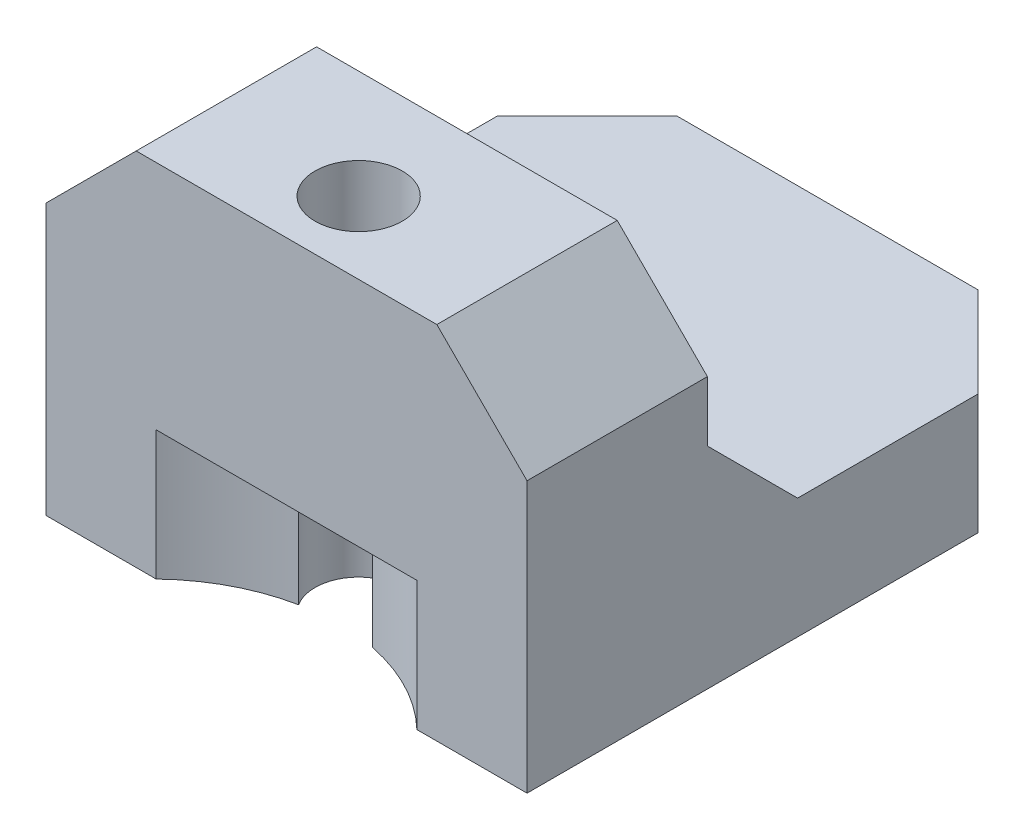
ISO-10303-21;
HEADER;
FILE_DESCRIPTION(('STEP AP214'),'2;1');
FILE_NAME('part.step','',(''),(''),'','','');
FILE_SCHEMA(('AUTOMOTIVE_DESIGN { 1 0 10303 214 1 1 1 1 }'));
ENDSEC;
DATA;
#1=APPLICATION_CONTEXT('core data for automotive mechanical design processes');
#2=APPLICATION_PROTOCOL_DEFINITION('international standard','automotive_design',2000,#1);
#3=PRODUCT_CONTEXT('',#1,'mechanical');
#4=PRODUCT('Part','Part','',(#3));
#5=PRODUCT_RELATED_PRODUCT_CATEGORY('part','',(#4));
#6=PRODUCT_DEFINITION_FORMATION('','',#4);
#7=PRODUCT_DEFINITION_CONTEXT('part definition',#1,'design');
#8=PRODUCT_DEFINITION('design','',#6,#7);
#9=PRODUCT_DEFINITION_SHAPE('','',#8);
#10=(LENGTH_UNIT() NAMED_UNIT(*) SI_UNIT(.MILLI.,.METRE.));
#11=(NAMED_UNIT(*) PLANE_ANGLE_UNIT() SI_UNIT($,.RADIAN.));
#12=(NAMED_UNIT(*) SI_UNIT($,.STERADIAN.) SOLID_ANGLE_UNIT());
#13=UNCERTAINTY_MEASURE_WITH_UNIT(LENGTH_MEASURE(1.E-05),#10,'distance_accuracy_value','');
#14=(GEOMETRIC_REPRESENTATION_CONTEXT(3) GLOBAL_UNCERTAINTY_ASSIGNED_CONTEXT((#13)) GLOBAL_UNIT_ASSIGNED_CONTEXT((#10,
#11,#12)) REPRESENTATION_CONTEXT('',''));
#15=CARTESIAN_POINT('',(0.,0.,0.));
#16=DIRECTION('',(0.,0.,1.));
#17=DIRECTION('',(1.,0.,0.));
#18=AXIS2_PLACEMENT_3D('',#15,#16,#17);
#19=CARTESIAN_POINT('',(8.,2.8,4.5));
#20=DIRECTION('',(0.,-1.,0.));
#21=DIRECTION('',(0.,0.,-1.));
#22=AXIS2_PLACEMENT_3D('',#19,#20,#21);
#23=PLANE('',#22);
#24=CARTESIAN_POINT('',(8.,2.8,4.5));
#25=DIRECTION('',(0.,-1.,0.));
#26=DIRECTION('',(0.,0.,-1.));
#27=AXIS2_PLACEMENT_3D('',#24,#25,#26);
#28=CIRCLE('',#27,6.25);
#29=CARTESIAN_POINT('',(9.22756617522469,2.8,-1.62826086956522));
#30=VERTEX_POINT('',#29);
#31=CARTESIAN_POINT('',(9.74999999999991,2.8,-1.50000000000003));
#32=VERTEX_POINT('',#31);
#33=EDGE_CURVE('E166',#30,#32,#28,.T.);
#34=ORIENTED_EDGE('',*,*,#33,.T.);
#35=DIRECTION('',(-1.,0.,0.));
#36=VECTOR('',#35,1.);
#37=CARTESIAN_POINT('',(3.66266210677563,2.8,-1.50000000000003));
#38=LINE('',#37,#36);
#39=CARTESIAN_POINT('',(9.13688170009023,2.8,-1.50000000000003));
#40=VERTEX_POINT('',#39);
#41=EDGE_CURVE('E296',#32,#40,#38,.T.);
#42=ORIENTED_EDGE('',*,*,#41,.T.);
#43=CARTESIAN_POINT('',(8.,2.8,-2.4));
#44=DIRECTION('',(0.,-1.,0.));
#45=DIRECTION('',(0.,0.,-1.));
#46=AXIS2_PLACEMENT_3D('',#43,#44,#45);
#47=CIRCLE('',#46,1.45);
#48=EDGE_CURVE('E290',#40,#30,#47,.F.);
#49=ORIENTED_EDGE('',*,*,#48,.T.);
#50=EDGE_LOOP('',(#34,#42,#49));
#51=FACE_BOUND('',#50,.T.);
#52=ADVANCED_FACE('F37',(#51),#23,.T.);
#53=CARTESIAN_POINT('',(8.,0.,-10.));
#54=DIRECTION('',(0.,1.,0.));
#55=DIRECTION('',(0.,0.,1.));
#56=AXIS2_PLACEMENT_3D('',#53,#54,#55);
#57=CYLINDRICAL_SURFACE('',#56,1.65);
#58=CARTESIAN_POINT('',(8.,0.,-10.));
#59=DIRECTION('',(0.,1.,0.));
#60=DIRECTION('',(0.,0.,1.));
#61=AXIS2_PLACEMENT_3D('',#58,#59,#60);
#62=CIRCLE('',#61,1.65);
#63=CARTESIAN_POINT('',(8.,0.,-8.35));
#64=VERTEX_POINT('',#63);
#65=EDGE_CURVE('E209',#64,#64,#62,.T.);
#66=ORIENTED_EDGE('',*,*,#65,.F.);
#67=EDGE_LOOP('',(#66));
#68=FACE_BOUND('',#67,.T.);
#69=CARTESIAN_POINT('',(8.,4.,-10.));
#70=DIRECTION('',(0.,1.,0.));
#71=DIRECTION('',(0.,0.,1.));
#72=AXIS2_PLACEMENT_3D('',#69,#70,#71);
#73=CIRCLE('',#72,1.65);
#74=CARTESIAN_POINT('',(8.,4.,-8.35));
#75=VERTEX_POINT('',#74);
#76=EDGE_CURVE('E208',#75,#75,#73,.T.);
#77=ORIENTED_EDGE('',*,*,#76,.T.);
#78=EDGE_LOOP('',(#77));
#79=FACE_BOUND('',#78,.T.);
#80=ADVANCED_FACE('F320',(#68,#79),#57,.F.);
#81=CARTESIAN_POINT('',(0.,7.00000000000005,-6.));
#82=DIRECTION('',(0.,0.707106781186544,-0.707106781186551));
#83=DIRECTION('',(1.,0.,0.));
#84=AXIS2_PLACEMENT_3D('',#81,#82,#83);
#85=PLANE('',#84);
#86=CARTESIAN_POINT('',(8.,3.00000000000001,-10.));
#87=DIRECTION('',(0.,0.707106781186544,-0.707106781186551));
#88=DIRECTION('',(0.,-0.707106781186551,-0.707106781186544));
#89=AXIS2_PLACEMENT_3D('',#86,#87,#88);
#90=ELLIPSE('',#89,4.24264068711931,3.);
#91=CARTESIAN_POINT('',(5.1715728752538,4.,-9.00000000000002));
#92=VERTEX_POINT('',#91);
#93=CARTESIAN_POINT('',(10.8284271247462,4.,-9.00000000000002));
#94=VERTEX_POINT('',#93);
#95=EDGE_CURVE('E288',#92,#94,#90,.T.);
#96=ORIENTED_EDGE('',*,*,#95,.F.);
#97=DIRECTION('',(1.,0.,0.));
#98=VECTOR('',#97,1.);
#99=CARTESIAN_POINT('',(16.,4.,-9.00000000000002));
#100=LINE('',#99,#98);
#101=CARTESIAN_POINT('',(0.,4.,-9.00000000000002));
#102=VERTEX_POINT('',#101);
#103=EDGE_CURVE('E262',#102,#92,#100,.T.);
#104=ORIENTED_EDGE('',*,*,#103,.F.);
#105=DIRECTION('',(0.,0.707106781186551,0.707106781186544));
#106=VECTOR('',#105,1.);
#107=CARTESIAN_POINT('',(0.,8.50000000000001,-4.50000000000006));
#108=LINE('',#107,#106);
#109=CARTESIAN_POINT('',(0.,7.00000000000005,-6.));
#110=VERTEX_POINT('',#109);
#111=EDGE_CURVE('E265',#110,#102,#108,.F.);
#112=ORIENTED_EDGE('',*,*,#111,.F.);
#113=DIRECTION('',(-1.,0.,0.));
#114=VECTOR('',#113,1.);
#115=CARTESIAN_POINT('',(0.,7.00000000000005,-6.));
#116=LINE('',#115,#114);
#117=CARTESIAN_POINT('',(16.,7.00000000000005,-6.));
#118=VERTEX_POINT('',#117);
#119=EDGE_CURVE('E257',#118,#110,#116,.T.);
#120=ORIENTED_EDGE('',*,*,#119,.F.);
#121=DIRECTION('',(0.,-0.707106781186551,-0.707106781186544));
#122=VECTOR('',#121,1.);
#123=CARTESIAN_POINT('',(16.,8.50000000000001,-4.50000000000006));
#124=LINE('',#123,#122);
#125=CARTESIAN_POINT('',(16.,4.,-9.00000000000002));
#126=VERTEX_POINT('',#125);
#127=EDGE_CURVE('E267',#126,#118,#124,.F.);
#128=ORIENTED_EDGE('',*,*,#127,.F.);
#129=DIRECTION('',(1.,0.,0.));
#130=VECTOR('',#129,1.);
#131=CARTESIAN_POINT('',(16.,4.,-9.00000000000002));
#132=LINE('',#131,#130);
#133=EDGE_CURVE('E260',#94,#126,#132,.T.);
#134=ORIENTED_EDGE('',*,*,#133,.F.);
#135=EDGE_LOOP('',(#96,#104,#112,#120,#128,#134));
#136=FACE_BOUND('',#135,.T.);
#137=ADVANCED_FACE('F325',(#136),#85,.T.);
#138=CARTESIAN_POINT('',(0.,4.,0.));
#139=DIRECTION('',(0.,-1.,0.));
#140=DIRECTION('',(0.,0.,-1.));
#141=AXIS2_PLACEMENT_3D('',#138,#139,#140);
#142=PLANE('',#141);
#143=ORIENTED_EDGE('',*,*,#103,.T.);
#144=CARTESIAN_POINT('',(8.,4.,-10.));
#145=DIRECTION('',(0.,1.,0.));
#146=DIRECTION('',(0.,0.,1.));
#147=AXIS2_PLACEMENT_3D('',#144,#145,#146);
#148=CIRCLE('',#147,3.);
#149=EDGE_CURVE('E197',#92,#94,#148,.T.);
#150=ORIENTED_EDGE('',*,*,#149,.T.);
#151=ORIENTED_EDGE('',*,*,#133,.T.);
#152=DIRECTION('',(0.,0.,-1.));
#153=VECTOR('',#152,1.);
#154=CARTESIAN_POINT('',(16.,4.,0.));
#155=LINE('',#154,#153);
#156=CARTESIAN_POINT('',(16.,4.,-15.));
#157=VERTEX_POINT('',#156);
#158=EDGE_CURVE('E218',#126,#157,#155,.T.);
#159=ORIENTED_EDGE('',*,*,#158,.T.);
#160=DIRECTION('',(0.707106781186546,0.,0.707106781186549));
#161=VECTOR('',#160,1.);
#162=CARTESIAN_POINT('',(13.,4.,-18.));
#163=LINE('',#162,#161);
#164=CARTESIAN_POINT('',(13.,4.,-18.));
#165=VERTEX_POINT('',#164);
#166=EDGE_CURVE('E250',#157,#165,#163,.F.);
#167=ORIENTED_EDGE('',*,*,#166,.T.);
#168=DIRECTION('',(-1.,0.,0.));
#169=VECTOR('',#168,1.);
#170=CARTESIAN_POINT('',(0.,4.,-18.));
#171=LINE('',#170,#169);
#172=CARTESIAN_POINT('',(3.00000000000001,4.,-18.));
#173=VERTEX_POINT('',#172);
#174=EDGE_CURVE('E221',#165,#173,#171,.T.);
#175=ORIENTED_EDGE('',*,*,#174,.T.);
#176=DIRECTION('',(0.707106781186549,0.,-0.707106781186546));
#177=VECTOR('',#176,1.);
#178=CARTESIAN_POINT('',(0.,4.,-15.));
#179=LINE('',#178,#177);
#180=CARTESIAN_POINT('',(0.,4.,-15.));
#181=VERTEX_POINT('',#180);
#182=EDGE_CURVE('E252',#173,#181,#179,.F.);
#183=ORIENTED_EDGE('',*,*,#182,.T.);
#184=DIRECTION('',(0.,0.,1.));
#185=VECTOR('',#184,1.);
#186=CARTESIAN_POINT('',(0.,4.,0.));
#187=LINE('',#186,#185);
#188=EDGE_CURVE('E215',#181,#102,#187,.T.);
#189=ORIENTED_EDGE('',*,*,#188,.T.);
#190=EDGE_LOOP('',(#143,#150,#151,#159,#167,#175,#183,#189));
#191=FACE_BOUND('',#190,.T.);
#192=ORIENTED_EDGE('',*,*,#76,.F.);
#193=EDGE_LOOP('',(#192));
#194=FACE_BOUND('',#193,.T.);
#195=ADVANCED_FACE('F354',(#191,#194),#142,.F.);
#196=CARTESIAN_POINT('',(0.,4.,0.));
#197=DIRECTION('',(1.,0.,0.));
#198=DIRECTION('',(0.,0.,-1.));
#199=AXIS2_PLACEMENT_3D('',#196,#197,#198);
#200=PLANE('',#199);
#201=DIRECTION('',(0.,-1.,0.));
#202=VECTOR('',#201,1.);
#203=CARTESIAN_POINT('',(0.,4.,0.));
#204=LINE('',#203,#202);
#205=CARTESIAN_POINT('',(0.,8.99999999999999,0.));
#206=VERTEX_POINT('',#205);
#207=CARTESIAN_POINT('',(0.,0.,0.));
#208=VERTEX_POINT('',#207);
#209=EDGE_CURVE('E236',#206,#208,#204,.T.);
#210=ORIENTED_EDGE('',*,*,#209,.F.);
#211=DIRECTION('',(0.,0.,-1.));
#212=VECTOR('',#211,1.);
#213=CARTESIAN_POINT('',(0.,8.99999999999999,0.));
#214=LINE('',#213,#212);
#215=CARTESIAN_POINT('',(0.,8.99999999999999,-6.));
#216=VERTEX_POINT('',#215);
#217=EDGE_CURVE('E280',#206,#216,#214,.T.);
#218=ORIENTED_EDGE('',*,*,#217,.T.);
#219=DIRECTION('',(0.,-1.,0.));
#220=VECTOR('',#219,1.);
#221=CARTESIAN_POINT('',(0.,12.,-6.));
#222=LINE('',#221,#220);
#223=EDGE_CURVE('E204',#216,#110,#222,.T.);
#224=ORIENTED_EDGE('',*,*,#223,.T.);
#225=ORIENTED_EDGE('',*,*,#111,.T.);
#226=ORIENTED_EDGE('',*,*,#188,.F.);
#227=DIRECTION('',(0.,-1.,0.));
#228=VECTOR('',#227,1.);
#229=CARTESIAN_POINT('',(0.,4.,-15.));
#230=LINE('',#229,#228);
#231=CARTESIAN_POINT('',(0.,0.,-15.));
#232=VERTEX_POINT('',#231);
#233=EDGE_CURVE('E238',#181,#232,#230,.T.);
#234=ORIENTED_EDGE('',*,*,#233,.T.);
#235=DIRECTION('',(0.,0.,1.));
#236=VECTOR('',#235,1.);
#237=CARTESIAN_POINT('',(0.,0.,0.));
#238=LINE('',#237,#236);
#239=EDGE_CURVE('E212',#232,#208,#238,.T.);
#240=ORIENTED_EDGE('',*,*,#239,.T.);
#241=EDGE_LOOP('',(#210,#218,#224,#225,#226,#234,#240));
#242=FACE_BOUND('',#241,.T.);
#243=ADVANCED_FACE('F357',(#242),#200,.F.);
#244=CARTESIAN_POINT('',(0.,4.,0.));
#245=DIRECTION('',(0.,0.,-1.));
#246=DIRECTION('',(-1.,0.,0.));
#247=AXIS2_PLACEMENT_3D('',#244,#245,#246);
#248=PLANE('',#247);
#249=DIRECTION('',(0.,-1.,0.));
#250=VECTOR('',#249,1.);
#251=CARTESIAN_POINT('',(3.66266210677563,2.8,0.));
#252=LINE('',#251,#250);
#253=CARTESIAN_POINT('',(3.66266210677563,0.,0.));
#254=VERTEX_POINT('',#253);
#255=CARTESIAN_POINT('',(3.66266210677563,4.30000000000001,0.));
#256=VERTEX_POINT('',#255);
#257=EDGE_CURVE('E53',#254,#256,#252,.F.);
#258=ORIENTED_EDGE('',*,*,#257,.T.);
#259=DIRECTION('',(1.,0.,0.));
#260=VECTOR('',#259,1.);
#261=CARTESIAN_POINT('',(12.3373378932244,4.30000000000001,0.));
#262=LINE('',#261,#260);
#263=CARTESIAN_POINT('',(12.3373378932244,4.30000000000001,0.));
#264=VERTEX_POINT('',#263);
#265=EDGE_CURVE('E301',#256,#264,#262,.T.);
#266=ORIENTED_EDGE('',*,*,#265,.T.);
#267=DIRECTION('',(0.,-1.,0.));
#268=VECTOR('',#267,1.);
#269=CARTESIAN_POINT('',(12.3373378932244,2.8,0.));
#270=LINE('',#269,#268);
#271=CARTESIAN_POINT('',(12.3373378932244,0.,0.));
#272=VERTEX_POINT('',#271);
#273=EDGE_CURVE('E60',#264,#272,#270,.T.);
#274=ORIENTED_EDGE('',*,*,#273,.T.);
#275=DIRECTION('',(1.,0.,0.));
#276=VECTOR('',#275,1.);
#277=CARTESIAN_POINT('',(0.,0.,0.));
#278=LINE('',#277,#276);
#279=CARTESIAN_POINT('',(16.,0.,0.));
#280=VERTEX_POINT('',#279);
#281=EDGE_CURVE('E181',#272,#280,#278,.T.);
#282=ORIENTED_EDGE('',*,*,#281,.T.);
#283=DIRECTION('',(0.,-1.,0.));
#284=VECTOR('',#283,1.);
#285=CARTESIAN_POINT('',(16.,4.,0.));
#286=LINE('',#285,#284);
#287=CARTESIAN_POINT('',(16.,8.99999999999999,0.));
#288=VERTEX_POINT('',#287);
#289=EDGE_CURVE('E224',#288,#280,#286,.T.);
#290=ORIENTED_EDGE('',*,*,#289,.F.);
#291=DIRECTION('',(0.707106781186546,-0.707106781186549,0.));
#292=VECTOR('',#291,1.);
#293=CARTESIAN_POINT('',(13.,12.,0.));
#294=LINE('',#293,#292);
#295=CARTESIAN_POINT('',(13.,12.,0.));
#296=VERTEX_POINT('',#295);
#297=EDGE_CURVE('E276',#288,#296,#294,.F.);
#298=ORIENTED_EDGE('',*,*,#297,.T.);
#299=DIRECTION('',(1.,0.,0.));
#300=VECTOR('',#299,1.);
#301=CARTESIAN_POINT('',(0.,12.,0.));
#302=LINE('',#301,#300);
#303=CARTESIAN_POINT('',(3.,12.,0.));
#304=VERTEX_POINT('',#303);
#305=EDGE_CURVE('E190',#304,#296,#302,.T.);
#306=ORIENTED_EDGE('',*,*,#305,.F.);
#307=DIRECTION('',(0.707106781186546,0.707106781186549,0.));
#308=VECTOR('',#307,1.);
#309=CARTESIAN_POINT('',(3.,12.,0.));
#310=LINE('',#309,#308);
#311=EDGE_CURVE('E278',#304,#206,#310,.F.);
#312=ORIENTED_EDGE('',*,*,#311,.T.);
#313=ORIENTED_EDGE('',*,*,#209,.T.);
#314=EDGE_CURVE('E227',#208,#254,#278,.T.);
#315=ORIENTED_EDGE('',*,*,#314,.T.);
#316=EDGE_LOOP('',(#258,#266,#274,#282,#290,#298,#306,#312,#313,#315));
#317=FACE_BOUND('',#316,.T.);
#318=ADVANCED_FACE('F311',(#317),#248,.F.);
#319=CARTESIAN_POINT('',(16.,4.,0.));
#320=DIRECTION('',(-1.,0.,0.));
#321=DIRECTION('',(0.,0.,1.));
#322=AXIS2_PLACEMENT_3D('',#319,#320,#321);
#323=PLANE('',#322);
#324=DIRECTION('',(0.,-1.,0.));
#325=VECTOR('',#324,1.);
#326=CARTESIAN_POINT('',(16.,12.,-6.));
#327=LINE('',#326,#325);
#328=CARTESIAN_POINT('',(16.,8.99999999999999,-6.));
#329=VERTEX_POINT('',#328);
#330=EDGE_CURVE('E206',#329,#118,#327,.T.);
#331=ORIENTED_EDGE('',*,*,#330,.F.);
#332=DIRECTION('',(0.,0.,1.));
#333=VECTOR('',#332,1.);
#334=CARTESIAN_POINT('',(16.,8.99999999999999,0.));
#335=LINE('',#334,#333);
#336=EDGE_CURVE('E286',#329,#288,#335,.T.);
#337=ORIENTED_EDGE('',*,*,#336,.T.);
#338=ORIENTED_EDGE('',*,*,#289,.T.);
#339=DIRECTION('',(0.,0.,-1.));
#340=VECTOR('',#339,1.);
#341=CARTESIAN_POINT('',(16.,0.,0.));
#342=LINE('',#341,#340);
#343=CARTESIAN_POINT('',(16.,0.,-15.));
#344=VERTEX_POINT('',#343);
#345=EDGE_CURVE('E229',#280,#344,#342,.T.);
#346=ORIENTED_EDGE('',*,*,#345,.T.);
#347=DIRECTION('',(0.,1.,0.));
#348=VECTOR('',#347,1.);
#349=CARTESIAN_POINT('',(16.,4.,-15.));
#350=LINE('',#349,#348);
#351=EDGE_CURVE('E254',#344,#157,#350,.T.);
#352=ORIENTED_EDGE('',*,*,#351,.T.);
#353=ORIENTED_EDGE('',*,*,#158,.F.);
#354=ORIENTED_EDGE('',*,*,#127,.T.);
#355=EDGE_LOOP('',(#331,#337,#338,#346,#352,#353,#354));
#356=FACE_BOUND('',#355,.T.);
#357=ADVANCED_FACE('F364',(#356),#323,.F.);
#358=CARTESIAN_POINT('',(0.,4.,-18.));
#359=DIRECTION('',(0.,0.,1.));
#360=DIRECTION('',(1.,0.,0.));
#361=AXIS2_PLACEMENT_3D('',#358,#359,#360);
#362=PLANE('',#361);
#363=DIRECTION('',(-1.,0.,0.));
#364=VECTOR('',#363,1.);
#365=CARTESIAN_POINT('',(0.,0.,-18.));
#366=LINE('',#365,#364);
#367=CARTESIAN_POINT('',(13.,0.,-18.));
#368=VERTEX_POINT('',#367);
#369=CARTESIAN_POINT('',(3.00000000000001,0.,-18.));
#370=VERTEX_POINT('',#369);
#371=EDGE_CURVE('E219',#368,#370,#366,.T.);
#372=ORIENTED_EDGE('',*,*,#371,.T.);
#373=DIRECTION('',(0.,1.,0.));
#374=VECTOR('',#373,1.);
#375=CARTESIAN_POINT('',(3.00000000000001,4.,-18.));
#376=LINE('',#375,#374);
#377=EDGE_CURVE('E248',#370,#173,#376,.T.);
#378=ORIENTED_EDGE('',*,*,#377,.T.);
#379=ORIENTED_EDGE('',*,*,#174,.F.);
#380=DIRECTION('',(0.,-1.,0.));
#381=VECTOR('',#380,1.);
#382=CARTESIAN_POINT('',(13.,4.,-18.));
#383=LINE('',#382,#381);
#384=EDGE_CURVE('E245',#165,#368,#383,.T.);
#385=ORIENTED_EDGE('',*,*,#384,.T.);
#386=EDGE_LOOP('',(#372,#378,#379,#385));
#387=FACE_BOUND('',#386,.T.);
#388=ADVANCED_FACE('F361',(#387),#362,.F.);
#389=CARTESIAN_POINT('',(0.,0.,0.));
#390=DIRECTION('',(0.,-1.,0.));
#391=DIRECTION('',(0.,0.,-1.));
#392=AXIS2_PLACEMENT_3D('',#389,#390,#391);
#393=PLANE('',#392);
#394=CARTESIAN_POINT('',(8.,0.,4.5));
#395=DIRECTION('',(0.,-1.,0.));
#396=DIRECTION('',(0.,0.,-1.));
#397=AXIS2_PLACEMENT_3D('',#394,#395,#396);
#398=CIRCLE('',#397,6.25);
#399=CARTESIAN_POINT('',(9.22756617522469,0.,-1.62826086956522));
#400=VERTEX_POINT('',#399);
#401=EDGE_CURVE('E164',#400,#272,#398,.T.);
#402=ORIENTED_EDGE('',*,*,#401,.F.);
#403=CARTESIAN_POINT('',(8.,0.,-2.4));
#404=DIRECTION('',(0.,1.,0.));
#405=DIRECTION('',(0.,0.,1.));
#406=AXIS2_PLACEMENT_3D('',#403,#404,#405);
#407=CIRCLE('',#406,1.45);
#408=CARTESIAN_POINT('',(6.77243382477532,0.,-1.62826086956522));
#409=VERTEX_POINT('',#408);
#410=EDGE_CURVE('E179',#400,#409,#407,.T.);
#411=ORIENTED_EDGE('',*,*,#410,.T.);
#412=EDGE_CURVE('E183',#254,#409,#398,.T.);
#413=ORIENTED_EDGE('',*,*,#412,.F.);
#414=ORIENTED_EDGE('',*,*,#314,.F.);
#415=ORIENTED_EDGE('',*,*,#239,.F.);
#416=DIRECTION('',(-0.707106781186549,0.,0.707106781186546));
#417=VECTOR('',#416,1.);
#418=CARTESIAN_POINT('',(-7.5,0.,-7.50000000000003));
#419=LINE('',#418,#417);
#420=EDGE_CURVE('E243',#232,#370,#419,.F.);
#421=ORIENTED_EDGE('',*,*,#420,.T.);
#422=ORIENTED_EDGE('',*,*,#371,.F.);
#423=DIRECTION('',(-0.707106781186546,0.,-0.707106781186549));
#424=VECTOR('',#423,1.);
#425=CARTESIAN_POINT('',(15.5,0.,-15.5));
#426=LINE('',#425,#424);
#427=EDGE_CURVE('E241',#368,#344,#426,.F.);
#428=ORIENTED_EDGE('',*,*,#427,.T.);
#429=ORIENTED_EDGE('',*,*,#345,.F.);
#430=ORIENTED_EDGE('',*,*,#281,.F.);
#431=EDGE_LOOP('',(#402,#411,#413,#414,#415,#421,#422,#428,#429,#430));
#432=FACE_BOUND('',#431,.T.);
#433=ORIENTED_EDGE('',*,*,#65,.T.);
#434=EDGE_LOOP('',(#433));
#435=FACE_BOUND('',#434,.T.);
#436=ADVANCED_FACE('F176',(#432,#435),#393,.T.);
#437=CARTESIAN_POINT('',(0.,12.,-6.));
#438=DIRECTION('',(0.,0.,1.));
#439=DIRECTION('',(1.,0.,0.));
#440=AXIS2_PLACEMENT_3D('',#437,#438,#439);
#441=PLANE('',#440);
#442=ORIENTED_EDGE('',*,*,#223,.F.);
#443=DIRECTION('',(-0.707106781186546,-0.707106781186549,0.));
#444=VECTOR('',#443,1.);
#445=CARTESIAN_POINT('',(3.,12.,-6.));
#446=LINE('',#445,#444);
#447=CARTESIAN_POINT('',(3.,12.,-6.));
#448=VERTEX_POINT('',#447);
#449=EDGE_CURVE('E284',#216,#448,#446,.F.);
#450=ORIENTED_EDGE('',*,*,#449,.T.);
#451=DIRECTION('',(-1.,0.,0.));
#452=VECTOR('',#451,1.);
#453=CARTESIAN_POINT('',(0.,12.,-6.));
#454=LINE('',#453,#452);
#455=CARTESIAN_POINT('',(13.,12.,-6.));
#456=VERTEX_POINT('',#455);
#457=EDGE_CURVE('E194',#456,#448,#454,.T.);
#458=ORIENTED_EDGE('',*,*,#457,.F.);
#459=DIRECTION('',(-0.707106781186546,0.707106781186549,0.));
#460=VECTOR('',#459,1.);
#461=CARTESIAN_POINT('',(13.,12.,-6.));
#462=LINE('',#461,#460);
#463=EDGE_CURVE('E282',#456,#329,#462,.F.);
#464=ORIENTED_EDGE('',*,*,#463,.T.);
#465=ORIENTED_EDGE('',*,*,#330,.T.);
#466=ORIENTED_EDGE('',*,*,#119,.T.);
#467=EDGE_LOOP('',(#442,#450,#458,#464,#465,#466));
#468=FACE_BOUND('',#467,.T.);
#469=ADVANCED_FACE('F349',(#468),#441,.F.);
#470=CARTESIAN_POINT('',(0.,12.,0.));
#471=DIRECTION('',(0.,-1.,0.));
#472=DIRECTION('',(0.,0.,-1.));
#473=AXIS2_PLACEMENT_3D('',#470,#471,#472);
#474=PLANE('',#473);
#475=CARTESIAN_POINT('',(8.,12.,-2.4));
#476=DIRECTION('',(0.,1.,0.));
#477=DIRECTION('',(0.,0.,1.));
#478=AXIS2_PLACEMENT_3D('',#475,#476,#477);
#479=CIRCLE('',#478,1.45);
#480=CARTESIAN_POINT('',(8.,12.,-0.95));
#481=VERTEX_POINT('',#480);
#482=EDGE_CURVE('E191',#481,#481,#479,.T.);
#483=ORIENTED_EDGE('',*,*,#482,.F.);
#484=EDGE_LOOP('',(#483));
#485=FACE_BOUND('',#484,.T.);
#486=ORIENTED_EDGE('',*,*,#457,.T.);
#487=DIRECTION('',(0.,0.,1.));
#488=VECTOR('',#487,1.);
#489=CARTESIAN_POINT('',(3.,12.,0.));
#490=LINE('',#489,#488);
#491=EDGE_CURVE('E273',#448,#304,#490,.T.);
#492=ORIENTED_EDGE('',*,*,#491,.T.);
#493=ORIENTED_EDGE('',*,*,#305,.T.);
#494=DIRECTION('',(0.,0.,-1.));
#495=VECTOR('',#494,1.);
#496=CARTESIAN_POINT('',(13.,12.,0.));
#497=LINE('',#496,#495);
#498=EDGE_CURVE('E270',#296,#456,#497,.T.);
#499=ORIENTED_EDGE('',*,*,#498,.T.);
#500=EDGE_LOOP('',(#486,#492,#493,#499));
#501=FACE_BOUND('',#500,.T.);
#502=ADVANCED_FACE('F346',(#485,#501),#474,.F.);
#503=CARTESIAN_POINT('',(8.,0.,-2.4));
#504=DIRECTION('',(0.,1.,0.));
#505=DIRECTION('',(0.,0.,1.));
#506=AXIS2_PLACEMENT_3D('',#503,#504,#505);
#507=CYLINDRICAL_SURFACE('',#506,1.45);
#508=ORIENTED_EDGE('',*,*,#48,.F.);
#509=CARTESIAN_POINT('',(8.,1.90000000000004,-2.4));
#510=DIRECTION('',(0.,-0.707106781186551,0.707106781186544));
#511=DIRECTION('',(0.,0.707106781186544,0.707106781186551));
#512=AXIS2_PLACEMENT_3D('',#509,#510,#511);
#513=ELLIPSE('',#512,2.05060966544098,1.45);
#514=CARTESIAN_POINT('',(6.86311829990977,2.8,-1.50000000000003));
#515=VERTEX_POINT('',#514);
#516=EDGE_CURVE('E299',#40,#515,#513,.T.);
#517=ORIENTED_EDGE('',*,*,#516,.T.);
#518=CARTESIAN_POINT('',(6.77243382477532,2.8,-1.62826086956522));
#519=VERTEX_POINT('',#518);
#520=EDGE_CURVE('E291',#519,#515,#47,.F.);
#521=ORIENTED_EDGE('',*,*,#520,.F.);
#522=DIRECTION('',(0.,-1.,0.));
#523=VECTOR('',#522,1.);
#524=CARTESIAN_POINT('',(6.77243382477531,1.4,-1.62826086956522));
#525=LINE('',#524,#523);
#526=EDGE_CURVE('E171',#519,#409,#525,.T.);
#527=ORIENTED_EDGE('',*,*,#526,.T.);
#528=ORIENTED_EDGE('',*,*,#410,.F.);
#529=DIRECTION('',(0.,-1.,0.));
#530=VECTOR('',#529,1.);
#531=CARTESIAN_POINT('',(9.22756617522469,1.4,-1.62826086956522));
#532=LINE('',#531,#530);
#533=EDGE_CURVE('E161',#400,#30,#532,.F.);
#534=ORIENTED_EDGE('',*,*,#533,.T.);
#535=EDGE_LOOP('',(#508,#517,#521,#527,#528,#534));
#536=FACE_BOUND('',#535,.T.);
#537=ORIENTED_EDGE('',*,*,#482,.T.);
#538=EDGE_LOOP('',(#537));
#539=FACE_BOUND('',#538,.T.);
#540=ADVANCED_FACE('F186',(#536,#539),#507,.F.);
#541=CARTESIAN_POINT('',(0.,4.,-15.));
#542=DIRECTION('',(0.707106781186546,0.,0.707106781186549));
#543=DIRECTION('',(0.,-1.,0.));
#544=AXIS2_PLACEMENT_3D('',#541,#542,#543);
#545=PLANE('',#544);
#546=ORIENTED_EDGE('',*,*,#182,.F.);
#547=ORIENTED_EDGE('',*,*,#377,.F.);
#548=ORIENTED_EDGE('',*,*,#420,.F.);
#549=ORIENTED_EDGE('',*,*,#233,.F.);
#550=EDGE_LOOP('',(#546,#547,#548,#549));
#551=FACE_BOUND('',#550,.T.);
#552=ADVANCED_FACE('F345',(#551),#545,.F.);
#553=CARTESIAN_POINT('',(13.,4.,-18.));
#554=DIRECTION('',(-0.707106781186549,0.,0.707106781186546));
#555=DIRECTION('',(0.,-1.,0.));
#556=AXIS2_PLACEMENT_3D('',#553,#554,#555);
#557=PLANE('',#556);
#558=ORIENTED_EDGE('',*,*,#166,.F.);
#559=ORIENTED_EDGE('',*,*,#351,.F.);
#560=ORIENTED_EDGE('',*,*,#427,.F.);
#561=ORIENTED_EDGE('',*,*,#384,.F.);
#562=EDGE_LOOP('',(#558,#559,#560,#561));
#563=FACE_BOUND('',#562,.T.);
#564=ADVANCED_FACE('F380',(#563),#557,.F.);
#565=CARTESIAN_POINT('',(3.,12.,0.));
#566=DIRECTION('',(0.707106781186549,-0.707106781186546,0.));
#567=DIRECTION('',(0.,0.,1.));
#568=AXIS2_PLACEMENT_3D('',#565,#566,#567);
#569=PLANE('',#568);
#570=ORIENTED_EDGE('',*,*,#449,.F.);
#571=ORIENTED_EDGE('',*,*,#217,.F.);
#572=ORIENTED_EDGE('',*,*,#311,.F.);
#573=ORIENTED_EDGE('',*,*,#491,.F.);
#574=EDGE_LOOP('',(#570,#571,#572,#573));
#575=FACE_BOUND('',#574,.T.);
#576=ADVANCED_FACE('F387',(#575),#569,.F.);
#577=CARTESIAN_POINT('',(13.,12.,0.));
#578=DIRECTION('',(-0.707106781186549,-0.707106781186546,0.));
#579=DIRECTION('',(0.,0.,-1.));
#580=AXIS2_PLACEMENT_3D('',#577,#578,#579);
#581=PLANE('',#580);
#582=ORIENTED_EDGE('',*,*,#297,.F.);
#583=ORIENTED_EDGE('',*,*,#336,.F.);
#584=ORIENTED_EDGE('',*,*,#463,.F.);
#585=ORIENTED_EDGE('',*,*,#498,.F.);
#586=EDGE_LOOP('',(#582,#583,#584,#585));
#587=FACE_BOUND('',#586,.T.);
#588=ADVANCED_FACE('F341',(#587),#581,.F.);
#589=CARTESIAN_POINT('',(8.,12.,-10.));
#590=DIRECTION('',(0.,-1.,0.));
#591=DIRECTION('',(0.,0.,-1.));
#592=AXIS2_PLACEMENT_3D('',#589,#590,#591);
#593=CYLINDRICAL_SURFACE('',#592,3.);
#594=ORIENTED_EDGE('',*,*,#95,.T.);
#595=ORIENTED_EDGE('',*,*,#149,.F.);
#596=EDGE_LOOP('',(#594,#595));
#597=FACE_BOUND('',#596,.T.);
#598=ADVANCED_FACE('F337',(#597),#593,.F.);
#599=CARTESIAN_POINT('',(8.,2.8,4.5));
#600=DIRECTION('',(0.,-1.,0.));
#601=DIRECTION('',(0.,0.,-1.));
#602=AXIS2_PLACEMENT_3D('',#599,#600,#601);
#603=CYLINDRICAL_SURFACE('',#602,6.25);
#604=ORIENTED_EDGE('',*,*,#33,.F.);
#605=ORIENTED_EDGE('',*,*,#533,.F.);
#606=ORIENTED_EDGE('',*,*,#401,.T.);
#607=ORIENTED_EDGE('',*,*,#273,.F.);
#608=CARTESIAN_POINT('',(8.,8.79999999999996,4.5));
#609=DIRECTION('',(0.,-0.707106781186551,0.707106781186544));
#610=DIRECTION('',(0.,-0.707106781186544,-0.707106781186551));
#611=AXIS2_PLACEMENT_3D('',#608,#609,#610);
#612=ELLIPSE('',#611,8.8388347648318,6.25);
#613=EDGE_CURVE('E11',#264,#32,#612,.F.);
#614=ORIENTED_EDGE('',*,*,#613,.T.);
#615=EDGE_LOOP('',(#604,#605,#606,#607,#614));
#616=FACE_BOUND('',#615,.T.);
#617=ADVANCED_FACE('F163',(#616),#603,.F.);
#618=ORIENTED_EDGE('',*,*,#412,.T.);
#619=ORIENTED_EDGE('',*,*,#526,.F.);
#620=CARTESIAN_POINT('',(6.25000000000009,2.8,-1.50000000000003));
#621=VERTEX_POINT('',#620);
#622=EDGE_CURVE('E182',#621,#519,#28,.T.);
#623=ORIENTED_EDGE('',*,*,#622,.F.);
#624=CARTESIAN_POINT('',(8.,8.79999999999996,4.5));
#625=DIRECTION('',(0.,-0.707106781186551,0.707106781186544));
#626=DIRECTION('',(0.,-0.707106781186544,-0.707106781186551));
#627=AXIS2_PLACEMENT_3D('',#624,#625,#626);
#628=ELLIPSE('',#627,8.8388347648318,6.25);
#629=EDGE_CURVE('E46',#621,#256,#628,.F.);
#630=ORIENTED_EDGE('',*,*,#629,.T.);
#631=ORIENTED_EDGE('',*,*,#257,.F.);
#632=EDGE_LOOP('',(#618,#619,#623,#630,#631));
#633=FACE_BOUND('',#632,.T.);
#634=ADVANCED_FACE('F306',(#633),#603,.F.);
#635=ORIENTED_EDGE('',*,*,#520,.T.);
#636=DIRECTION('',(-1.,0.,0.));
#637=VECTOR('',#636,1.);
#638=CARTESIAN_POINT('',(3.66266210677563,2.8,-1.50000000000003));
#639=LINE('',#638,#637);
#640=EDGE_CURVE('E170',#515,#621,#639,.T.);
#641=ORIENTED_EDGE('',*,*,#640,.T.);
#642=ORIENTED_EDGE('',*,*,#622,.T.);
#643=EDGE_LOOP('',(#635,#641,#642));
#644=FACE_BOUND('',#643,.T.);
#645=ADVANCED_FACE('F318',(#644),#23,.T.);
#646=CARTESIAN_POINT('',(8.,2.8,-1.50000000000003));
#647=DIRECTION('',(0.,-0.707106781186551,0.707106781186544));
#648=DIRECTION('',(1.,0.,0.));
#649=AXIS2_PLACEMENT_3D('',#646,#647,#648);
#650=PLANE('',#649);
#651=ORIENTED_EDGE('',*,*,#613,.F.);
#652=ORIENTED_EDGE('',*,*,#265,.F.);
#653=ORIENTED_EDGE('',*,*,#629,.F.);
#654=ORIENTED_EDGE('',*,*,#640,.F.);
#655=ORIENTED_EDGE('',*,*,#516,.F.);
#656=ORIENTED_EDGE('',*,*,#41,.F.);
#657=EDGE_LOOP('',(#651,#652,#653,#654,#655,#656));
#658=FACE_BOUND('',#657,.T.);
#659=ADVANCED_FACE('F40',(#658),#650,.T.);
#660=CLOSED_SHELL('',(#52,#80,#137,#195,#243,#318,#357,#388,#436,#469,#502,#540,#552,#564,#576,
#588,#598,#617,#634,#645,#659));
#661=MANIFOLD_SOLID_BREP('B2',#660);
#662=ADVANCED_BREP_SHAPE_REPRESENTATION('',(#18,#661),#14);
#663=SHAPE_DEFINITION_REPRESENTATION(#9,#662);
ENDSEC;
END-ISO-10303-21;
